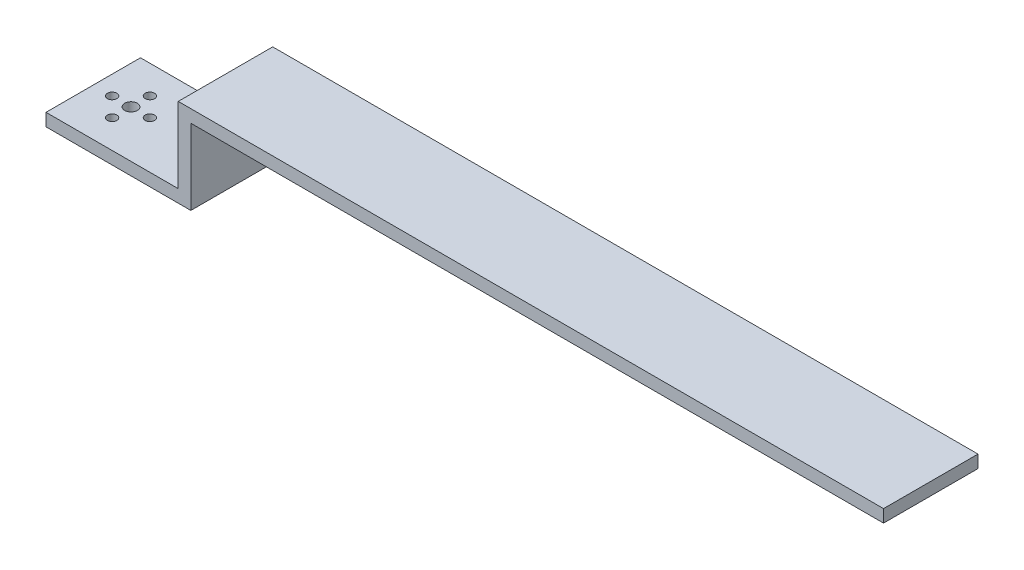
ISO-10303-21;
HEADER;
FILE_DESCRIPTION(('STEP AP214'),'2;1');
FILE_NAME('part.step','',(''),(''),'','','');
FILE_SCHEMA(('AUTOMOTIVE_DESIGN { 1 0 10303 214 1 1 1 1 }'));
ENDSEC;
DATA;
#1=APPLICATION_CONTEXT('core data for automotive mechanical design processes');
#2=APPLICATION_PROTOCOL_DEFINITION('international standard','automotive_design',2000,#1);
#3=PRODUCT_CONTEXT('',#1,'mechanical');
#4=PRODUCT('Part','Part','',(#3));
#5=PRODUCT_RELATED_PRODUCT_CATEGORY('part','',(#4));
#6=PRODUCT_DEFINITION_FORMATION('','',#4);
#7=PRODUCT_DEFINITION_CONTEXT('part definition',#1,'design');
#8=PRODUCT_DEFINITION('design','',#6,#7);
#9=PRODUCT_DEFINITION_SHAPE('','',#8);
#10=(LENGTH_UNIT() NAMED_UNIT(*) SI_UNIT(.MILLI.,.METRE.));
#11=(NAMED_UNIT(*) PLANE_ANGLE_UNIT() SI_UNIT($,.RADIAN.));
#12=(NAMED_UNIT(*) SI_UNIT($,.STERADIAN.) SOLID_ANGLE_UNIT());
#13=UNCERTAINTY_MEASURE_WITH_UNIT(LENGTH_MEASURE(1.E-05),#10,'distance_accuracy_value','');
#14=(GEOMETRIC_REPRESENTATION_CONTEXT(3) GLOBAL_UNCERTAINTY_ASSIGNED_CONTEXT((#13)) GLOBAL_UNIT_ASSIGNED_CONTEXT((#10,
#11,#12)) REPRESENTATION_CONTEXT('',''));
#15=CARTESIAN_POINT('',(0.,0.,0.));
#16=DIRECTION('',(0.,0.,1.));
#17=DIRECTION('',(1.,0.,0.));
#18=AXIS2_PLACEMENT_3D('',#15,#16,#17);
#19=CARTESIAN_POINT('',(23.,4.,-15.));
#20=DIRECTION('',(-1.,0.,0.));
#21=DIRECTION('',(0.,0.,1.));
#22=AXIS2_PLACEMENT_3D('',#19,#20,#21);
#23=PLANE('',#22);
#24=DIRECTION('',(0.,0.,-1.));
#25=VECTOR('',#24,1.);
#26=CARTESIAN_POINT('',(23.,24.,15.));
#27=LINE('',#26,#25);
#28=CARTESIAN_POINT('',(23.,24.,15.));
#29=VERTEX_POINT('',#28);
#30=CARTESIAN_POINT('',(23.,24.,-15.));
#31=VERTEX_POINT('',#30);
#32=EDGE_CURVE('E47',#29,#31,#27,.T.);
#33=ORIENTED_EDGE('',*,*,#32,.F.);
#34=DIRECTION('',(0.,-1.,0.));
#35=VECTOR('',#34,1.);
#36=CARTESIAN_POINT('',(23.,4.,15.));
#37=LINE('',#36,#35);
#38=CARTESIAN_POINT('',(23.,0.,15.));
#39=VERTEX_POINT('',#38);
#40=EDGE_CURVE('E119',#29,#39,#37,.T.);
#41=ORIENTED_EDGE('',*,*,#40,.T.);
#42=DIRECTION('',(0.,0.,-1.));
#43=VECTOR('',#42,1.);
#44=CARTESIAN_POINT('',(23.,0.,-15.));
#45=LINE('',#44,#43);
#46=CARTESIAN_POINT('',(23.,0.,-15.));
#47=VERTEX_POINT('',#46);
#48=EDGE_CURVE('E165',#39,#47,#45,.T.);
#49=ORIENTED_EDGE('',*,*,#48,.T.);
#50=DIRECTION('',(0.,-1.,0.));
#51=VECTOR('',#50,1.);
#52=CARTESIAN_POINT('',(23.,4.,-15.));
#53=LINE('',#52,#51);
#54=EDGE_CURVE('E11',#31,#47,#53,.T.);
#55=ORIENTED_EDGE('',*,*,#54,.F.);
#56=EDGE_LOOP('',(#33,#41,#49,#55));
#57=FACE_BOUND('',#56,.T.);
#58=ADVANCED_FACE('F33',(#57),#23,.F.);
#59=CARTESIAN_POINT('',(0.,4.,0.));
#60=DIRECTION('',(0.,1.,0.));
#61=DIRECTION('',(0.,0.,1.));
#62=AXIS2_PLACEMENT_3D('',#59,#60,#61);
#63=PLANE('',#62);
#64=DIRECTION('',(0.,0.,1.));
#65=VECTOR('',#64,1.);
#66=CARTESIAN_POINT('',(19.,4.,-15.));
#67=LINE('',#66,#65);
#68=CARTESIAN_POINT('',(19.,4.,-15.));
#69=VERTEX_POINT('',#68);
#70=CARTESIAN_POINT('',(19.,4.,15.));
#71=VERTEX_POINT('',#70);
#72=EDGE_CURVE('E55',#69,#71,#67,.T.);
#73=ORIENTED_EDGE('',*,*,#72,.F.);
#74=DIRECTION('',(-1.,0.,0.));
#75=VECTOR('',#74,1.);
#76=CARTESIAN_POINT('',(-23.,4.,-15.));
#77=LINE('',#76,#75);
#78=CARTESIAN_POINT('',(-23.,4.,-15.));
#79=VERTEX_POINT('',#78);
#80=EDGE_CURVE('E168',#69,#79,#77,.T.);
#81=ORIENTED_EDGE('',*,*,#80,.T.);
#82=DIRECTION('',(0.,0.,1.));
#83=VECTOR('',#82,1.);
#84=CARTESIAN_POINT('',(-23.,4.,-15.));
#85=LINE('',#84,#83);
#86=CARTESIAN_POINT('',(-23.,4.,15.));
#87=VERTEX_POINT('',#86);
#88=EDGE_CURVE('E170',#79,#87,#85,.T.);
#89=ORIENTED_EDGE('',*,*,#88,.T.);
#90=DIRECTION('',(1.,0.,0.));
#91=VECTOR('',#90,1.);
#92=CARTESIAN_POINT('',(-23.,4.,15.));
#93=LINE('',#92,#91);
#94=EDGE_CURVE('E173',#87,#71,#93,.T.);
#95=ORIENTED_EDGE('',*,*,#94,.T.);
#96=EDGE_LOOP('',(#73,#81,#89,#95));
#97=FACE_BOUND('',#96,.T.);
#98=CARTESIAN_POINT('',(-4.99999999999999,4.,0.));
#99=DIRECTION('',(0.,1.,0.));
#100=DIRECTION('',(0.,0.,1.));
#101=AXIS2_PLACEMENT_3D('',#98,#99,#100);
#102=CIRCLE('',#101,1.5);
#103=CARTESIAN_POINT('',(-4.99999999999999,4.,1.49999999999999));
#104=VERTEX_POINT('',#103);
#105=EDGE_CURVE('E144',#104,#104,#102,.T.);
#106=ORIENTED_EDGE('',*,*,#105,.F.);
#107=EDGE_LOOP('',(#106));
#108=FACE_BOUND('',#107,.T.);
#109=CARTESIAN_POINT('',(-11.,4.,0.));
#110=DIRECTION('',(0.,1.,0.));
#111=DIRECTION('',(0.,0.,1.));
#112=AXIS2_PLACEMENT_3D('',#109,#110,#111);
#113=CIRCLE('',#112,2.);
#114=CARTESIAN_POINT('',(-11.,4.,1.99999999999999));
#115=VERTEX_POINT('',#114);
#116=EDGE_CURVE('E156',#115,#115,#113,.T.);
#117=ORIENTED_EDGE('',*,*,#116,.F.);
#118=EDGE_LOOP('',(#117));
#119=FACE_BOUND('',#118,.T.);
#120=CARTESIAN_POINT('',(-17.,4.,0.));
#121=DIRECTION('',(0.,1.,0.));
#122=DIRECTION('',(0.,0.,1.));
#123=AXIS2_PLACEMENT_3D('',#120,#121,#122);
#124=CIRCLE('',#123,1.5);
#125=CARTESIAN_POINT('',(-17.,4.,1.49999999999999));
#126=VERTEX_POINT('',#125);
#127=EDGE_CURVE('E162',#126,#126,#124,.T.);
#128=ORIENTED_EDGE('',*,*,#127,.F.);
#129=EDGE_LOOP('',(#128));
#130=FACE_BOUND('',#129,.T.);
#131=CARTESIAN_POINT('',(-11.,4.,-6.00000000000001));
#132=DIRECTION('',(0.,1.,0.));
#133=DIRECTION('',(0.,0.,1.));
#134=AXIS2_PLACEMENT_3D('',#131,#132,#133);
#135=CIRCLE('',#134,1.5);
#136=CARTESIAN_POINT('',(-11.,4.,-4.50000000000001));
#137=VERTEX_POINT('',#136);
#138=EDGE_CURVE('E150',#137,#137,#135,.T.);
#139=ORIENTED_EDGE('',*,*,#138,.F.);
#140=EDGE_LOOP('',(#139));
#141=FACE_BOUND('',#140,.T.);
#142=CARTESIAN_POINT('',(-11.,4.,5.99999999999999));
#143=DIRECTION('',(0.,1.,0.));
#144=DIRECTION('',(0.,0.,1.));
#145=AXIS2_PLACEMENT_3D('',#142,#143,#144);
#146=CIRCLE('',#145,1.50000000000002);
#147=CARTESIAN_POINT('',(-11.,4.,7.50000000000001));
#148=VERTEX_POINT('',#147);
#149=EDGE_CURVE('E138',#148,#148,#146,.T.);
#150=ORIENTED_EDGE('',*,*,#149,.F.);
#151=EDGE_LOOP('',(#150));
#152=FACE_BOUND('',#151,.T.);
#153=ADVANCED_FACE('F201',(#97,#108,#119,#130,#141,#152),#63,.T.);
#154=CARTESIAN_POINT('',(0.,0.,0.));
#155=DIRECTION('',(0.,1.,0.));
#156=DIRECTION('',(0.,0.,1.));
#157=AXIS2_PLACEMENT_3D('',#154,#155,#156);
#158=PLANE('',#157);
#159=ORIENTED_EDGE('',*,*,#48,.F.);
#160=DIRECTION('',(1.,0.,0.));
#161=VECTOR('',#160,1.);
#162=CARTESIAN_POINT('',(-23.,0.,15.));
#163=LINE('',#162,#161);
#164=CARTESIAN_POINT('',(-23.,0.,15.));
#165=VERTEX_POINT('',#164);
#166=EDGE_CURVE('E171',#165,#39,#163,.T.);
#167=ORIENTED_EDGE('',*,*,#166,.F.);
#168=DIRECTION('',(0.,0.,1.));
#169=VECTOR('',#168,1.);
#170=CARTESIAN_POINT('',(-23.,0.,-15.));
#171=LINE('',#170,#169);
#172=CARTESIAN_POINT('',(-23.,0.,-15.));
#173=VERTEX_POINT('',#172);
#174=EDGE_CURVE('E179',#173,#165,#171,.T.);
#175=ORIENTED_EDGE('',*,*,#174,.F.);
#176=DIRECTION('',(-1.,0.,0.));
#177=VECTOR('',#176,1.);
#178=CARTESIAN_POINT('',(-23.,0.,-15.));
#179=LINE('',#178,#177);
#180=EDGE_CURVE('E177',#47,#173,#179,.T.);
#181=ORIENTED_EDGE('',*,*,#180,.F.);
#182=EDGE_LOOP('',(#159,#167,#175,#181));
#183=FACE_BOUND('',#182,.T.);
#184=CARTESIAN_POINT('',(-17.,0.,0.));
#185=DIRECTION('',(0.,1.,0.));
#186=DIRECTION('',(0.,0.,1.));
#187=AXIS2_PLACEMENT_3D('',#184,#185,#186);
#188=CIRCLE('',#187,1.5);
#189=CARTESIAN_POINT('',(-17.,0.,1.49999999999999));
#190=VERTEX_POINT('',#189);
#191=EDGE_CURVE('E159',#190,#190,#188,.T.);
#192=ORIENTED_EDGE('',*,*,#191,.T.);
#193=EDGE_LOOP('',(#192));
#194=FACE_BOUND('',#193,.T.);
#195=CARTESIAN_POINT('',(-11.,0.,0.));
#196=DIRECTION('',(0.,1.,0.));
#197=DIRECTION('',(0.,0.,1.));
#198=AXIS2_PLACEMENT_3D('',#195,#196,#197);
#199=CIRCLE('',#198,2.);
#200=CARTESIAN_POINT('',(-11.,0.,1.99999999999999));
#201=VERTEX_POINT('',#200);
#202=EDGE_CURVE('E153',#201,#201,#199,.T.);
#203=ORIENTED_EDGE('',*,*,#202,.T.);
#204=EDGE_LOOP('',(#203));
#205=FACE_BOUND('',#204,.T.);
#206=CARTESIAN_POINT('',(-11.,0.,-6.00000000000001));
#207=DIRECTION('',(0.,1.,0.));
#208=DIRECTION('',(0.,0.,1.));
#209=AXIS2_PLACEMENT_3D('',#206,#207,#208);
#210=CIRCLE('',#209,1.5);
#211=CARTESIAN_POINT('',(-11.,0.,-4.50000000000001));
#212=VERTEX_POINT('',#211);
#213=EDGE_CURVE('E147',#212,#212,#210,.T.);
#214=ORIENTED_EDGE('',*,*,#213,.T.);
#215=EDGE_LOOP('',(#214));
#216=FACE_BOUND('',#215,.T.);
#217=CARTESIAN_POINT('',(-4.99999999999999,0.,0.));
#218=DIRECTION('',(0.,1.,0.));
#219=DIRECTION('',(0.,0.,1.));
#220=AXIS2_PLACEMENT_3D('',#217,#218,#219);
#221=CIRCLE('',#220,1.5);
#222=CARTESIAN_POINT('',(-4.99999999999999,0.,1.49999999999999));
#223=VERTEX_POINT('',#222);
#224=EDGE_CURVE('E141',#223,#223,#221,.T.);
#225=ORIENTED_EDGE('',*,*,#224,.T.);
#226=EDGE_LOOP('',(#225));
#227=FACE_BOUND('',#226,.T.);
#228=CARTESIAN_POINT('',(-11.,0.,5.99999999999999));
#229=DIRECTION('',(0.,1.,0.));
#230=DIRECTION('',(0.,0.,1.));
#231=AXIS2_PLACEMENT_3D('',#228,#229,#230);
#232=CIRCLE('',#231,1.50000000000002);
#233=CARTESIAN_POINT('',(-11.,0.,7.50000000000001));
#234=VERTEX_POINT('',#233);
#235=EDGE_CURVE('E137',#234,#234,#232,.T.);
#236=ORIENTED_EDGE('',*,*,#235,.T.);
#237=EDGE_LOOP('',(#236));
#238=FACE_BOUND('',#237,.T.);
#239=ADVANCED_FACE('F197',(#183,#194,#205,#216,#227,#238),#158,.F.);
#240=CARTESIAN_POINT('',(-23.,4.,-15.));
#241=DIRECTION('',(0.,0.,1.));
#242=DIRECTION('',(1.,0.,0.));
#243=AXIS2_PLACEMENT_3D('',#240,#241,#242);
#244=PLANE('',#243);
#245=ORIENTED_EDGE('',*,*,#180,.T.);
#246=DIRECTION('',(0.,-1.,0.));
#247=VECTOR('',#246,1.);
#248=CARTESIAN_POINT('',(-23.,4.,-15.));
#249=LINE('',#248,#247);
#250=EDGE_CURVE('E40',#79,#173,#249,.T.);
#251=ORIENTED_EDGE('',*,*,#250,.F.);
#252=ORIENTED_EDGE('',*,*,#80,.F.);
#253=DIRECTION('',(0.,-1.,0.));
#254=VECTOR('',#253,1.);
#255=CARTESIAN_POINT('',(19.,28.,-15.));
#256=LINE('',#255,#254);
#257=CARTESIAN_POINT('',(19.,28.,-15.));
#258=VERTEX_POINT('',#257);
#259=EDGE_CURVE('E134',#258,#69,#256,.T.);
#260=ORIENTED_EDGE('',*,*,#259,.F.);
#261=DIRECTION('',(-1.,0.,0.));
#262=VECTOR('',#261,1.);
#263=CARTESIAN_POINT('',(23.,28.,-15.));
#264=LINE('',#263,#262);
#265=CARTESIAN_POINT('',(243.,28.,-15.0000000000001));
#266=VERTEX_POINT('',#265);
#267=EDGE_CURVE('E121',#266,#258,#264,.T.);
#268=ORIENTED_EDGE('',*,*,#267,.F.);
#269=DIRECTION('',(0.,1.,0.));
#270=VECTOR('',#269,1.);
#271=CARTESIAN_POINT('',(243.,28.,-15.0000000000001));
#272=LINE('',#271,#270);
#273=CARTESIAN_POINT('',(243.,24.,-15.0000000000001));
#274=VERTEX_POINT('',#273);
#275=EDGE_CURVE('E106',#274,#266,#272,.T.);
#276=ORIENTED_EDGE('',*,*,#275,.F.);
#277=DIRECTION('',(-1.,0.,0.));
#278=VECTOR('',#277,1.);
#279=CARTESIAN_POINT('',(243.,24.,-15.0000000000001));
#280=LINE('',#279,#278);
#281=EDGE_CURVE('E102',#274,#31,#280,.T.);
#282=ORIENTED_EDGE('',*,*,#281,.T.);
#283=ORIENTED_EDGE('',*,*,#54,.T.);
#284=EDGE_LOOP('',(#245,#251,#252,#260,#268,#276,#282,#283));
#285=FACE_BOUND('',#284,.T.);
#286=ADVANCED_FACE('F207',(#285),#244,.F.);
#287=CARTESIAN_POINT('',(-23.,4.,-15.));
#288=DIRECTION('',(1.,0.,0.));
#289=DIRECTION('',(0.,0.,-1.));
#290=AXIS2_PLACEMENT_3D('',#287,#288,#289);
#291=PLANE('',#290);
#292=ORIENTED_EDGE('',*,*,#174,.T.);
#293=DIRECTION('',(0.,-1.,0.));
#294=VECTOR('',#293,1.);
#295=CARTESIAN_POINT('',(-23.,4.,15.));
#296=LINE('',#295,#294);
#297=EDGE_CURVE('E183',#87,#165,#296,.T.);
#298=ORIENTED_EDGE('',*,*,#297,.F.);
#299=ORIENTED_EDGE('',*,*,#88,.F.);
#300=ORIENTED_EDGE('',*,*,#250,.T.);
#301=EDGE_LOOP('',(#292,#298,#299,#300));
#302=FACE_BOUND('',#301,.T.);
#303=ADVANCED_FACE('F190',(#302),#291,.F.);
#304=CARTESIAN_POINT('',(-23.,4.,15.));
#305=DIRECTION('',(0.,0.,-1.));
#306=DIRECTION('',(-1.,0.,0.));
#307=AXIS2_PLACEMENT_3D('',#304,#305,#306);
#308=PLANE('',#307);
#309=ORIENTED_EDGE('',*,*,#166,.T.);
#310=ORIENTED_EDGE('',*,*,#40,.F.);
#311=DIRECTION('',(-1.,0.,0.));
#312=VECTOR('',#311,1.);
#313=CARTESIAN_POINT('',(243.,24.,14.9999999999999));
#314=LINE('',#313,#312);
#315=CARTESIAN_POINT('',(243.,24.,14.9999999999999));
#316=VERTEX_POINT('',#315);
#317=EDGE_CURVE('E100',#316,#29,#314,.T.);
#318=ORIENTED_EDGE('',*,*,#317,.F.);
#319=DIRECTION('',(0.,-1.,0.));
#320=VECTOR('',#319,1.);
#321=CARTESIAN_POINT('',(243.,28.,14.9999999999999));
#322=LINE('',#321,#320);
#323=CARTESIAN_POINT('',(243.,28.,14.9999999999999));
#324=VERTEX_POINT('',#323);
#325=EDGE_CURVE('E107',#324,#316,#322,.T.);
#326=ORIENTED_EDGE('',*,*,#325,.F.);
#327=DIRECTION('',(1.,0.,0.));
#328=VECTOR('',#327,1.);
#329=CARTESIAN_POINT('',(23.,28.,15.));
#330=LINE('',#329,#328);
#331=CARTESIAN_POINT('',(19.,28.,15.));
#332=VERTEX_POINT('',#331);
#333=EDGE_CURVE('E129',#332,#324,#330,.T.);
#334=ORIENTED_EDGE('',*,*,#333,.F.);
#335=DIRECTION('',(0.,-1.,0.));
#336=VECTOR('',#335,1.);
#337=CARTESIAN_POINT('',(19.,28.,15.));
#338=LINE('',#337,#336);
#339=EDGE_CURVE('E130',#332,#71,#338,.T.);
#340=ORIENTED_EDGE('',*,*,#339,.T.);
#341=ORIENTED_EDGE('',*,*,#94,.F.);
#342=ORIENTED_EDGE('',*,*,#297,.T.);
#343=EDGE_LOOP('',(#309,#310,#318,#326,#334,#340,#341,#342));
#344=FACE_BOUND('',#343,.T.);
#345=ADVANCED_FACE('F118',(#344),#308,.F.);
#346=CARTESIAN_POINT('',(-17.,4.,0.));
#347=DIRECTION('',(0.,-1.,0.));
#348=DIRECTION('',(0.,0.,-1.));
#349=AXIS2_PLACEMENT_3D('',#346,#347,#348);
#350=CYLINDRICAL_SURFACE('',#349,1.5);
#351=ORIENTED_EDGE('',*,*,#127,.T.);
#352=EDGE_LOOP('',(#351));
#353=FACE_BOUND('',#352,.T.);
#354=ORIENTED_EDGE('',*,*,#191,.F.);
#355=EDGE_LOOP('',(#354));
#356=FACE_BOUND('',#355,.T.);
#357=ADVANCED_FACE('F222',(#353,#356),#350,.F.);
#358=CARTESIAN_POINT('',(-11.,4.,0.));
#359=DIRECTION('',(0.,-1.,0.));
#360=DIRECTION('',(0.,0.,-1.));
#361=AXIS2_PLACEMENT_3D('',#358,#359,#360);
#362=CYLINDRICAL_SURFACE('',#361,2.);
#363=ORIENTED_EDGE('',*,*,#116,.T.);
#364=EDGE_LOOP('',(#363));
#365=FACE_BOUND('',#364,.T.);
#366=ORIENTED_EDGE('',*,*,#202,.F.);
#367=EDGE_LOOP('',(#366));
#368=FACE_BOUND('',#367,.T.);
#369=ADVANCED_FACE('F248',(#365,#368),#362,.F.);
#370=CARTESIAN_POINT('',(-11.,4.,-6.00000000000001));
#371=DIRECTION('',(0.,-1.,0.));
#372=DIRECTION('',(0.,0.,-1.));
#373=AXIS2_PLACEMENT_3D('',#370,#371,#372);
#374=CYLINDRICAL_SURFACE('',#373,1.5);
#375=ORIENTED_EDGE('',*,*,#138,.T.);
#376=EDGE_LOOP('',(#375));
#377=FACE_BOUND('',#376,.T.);
#378=ORIENTED_EDGE('',*,*,#213,.F.);
#379=EDGE_LOOP('',(#378));
#380=FACE_BOUND('',#379,.T.);
#381=ADVANCED_FACE('F255',(#377,#380),#374,.F.);
#382=CARTESIAN_POINT('',(-4.99999999999999,4.,0.));
#383=DIRECTION('',(0.,-1.,0.));
#384=DIRECTION('',(0.,0.,-1.));
#385=AXIS2_PLACEMENT_3D('',#382,#383,#384);
#386=CYLINDRICAL_SURFACE('',#385,1.5);
#387=ORIENTED_EDGE('',*,*,#105,.T.);
#388=EDGE_LOOP('',(#387));
#389=FACE_BOUND('',#388,.T.);
#390=ORIENTED_EDGE('',*,*,#224,.F.);
#391=EDGE_LOOP('',(#390));
#392=FACE_BOUND('',#391,.T.);
#393=ADVANCED_FACE('F262',(#389,#392),#386,.F.);
#394=CARTESIAN_POINT('',(-11.,4.,5.99999999999999));
#395=DIRECTION('',(0.,-1.,0.));
#396=DIRECTION('',(0.,0.,-1.));
#397=AXIS2_PLACEMENT_3D('',#394,#395,#396);
#398=CYLINDRICAL_SURFACE('',#397,1.50000000000002);
#399=ORIENTED_EDGE('',*,*,#149,.T.);
#400=EDGE_LOOP('',(#399));
#401=FACE_BOUND('',#400,.T.);
#402=ORIENTED_EDGE('',*,*,#235,.F.);
#403=EDGE_LOOP('',(#402));
#404=FACE_BOUND('',#403,.T.);
#405=ADVANCED_FACE('F270',(#401,#404),#398,.F.);
#406=CARTESIAN_POINT('',(19.,28.,-15.));
#407=DIRECTION('',(1.,0.,0.));
#408=DIRECTION('',(0.,0.,-1.));
#409=AXIS2_PLACEMENT_3D('',#406,#407,#408);
#410=PLANE('',#409);
#411=ORIENTED_EDGE('',*,*,#72,.T.);
#412=ORIENTED_EDGE('',*,*,#339,.F.);
#413=DIRECTION('',(0.,0.,1.));
#414=VECTOR('',#413,1.);
#415=CARTESIAN_POINT('',(19.,28.,-15.));
#416=LINE('',#415,#414);
#417=EDGE_CURVE('E127',#258,#332,#416,.T.);
#418=ORIENTED_EDGE('',*,*,#417,.F.);
#419=ORIENTED_EDGE('',*,*,#259,.T.);
#420=EDGE_LOOP('',(#411,#412,#418,#419));
#421=FACE_BOUND('',#420,.T.);
#422=ADVANCED_FACE('F204',(#421),#410,.F.);
#423=CARTESIAN_POINT('',(0.,28.,0.));
#424=DIRECTION('',(0.,-1.,0.));
#425=DIRECTION('',(0.,0.,-1.));
#426=AXIS2_PLACEMENT_3D('',#423,#424,#425);
#427=PLANE('',#426);
#428=ORIENTED_EDGE('',*,*,#333,.T.);
#429=DIRECTION('',(0.,0.,1.));
#430=VECTOR('',#429,1.);
#431=CARTESIAN_POINT('',(243.,28.,14.9999999999999));
#432=LINE('',#431,#430);
#433=EDGE_CURVE('E113',#266,#324,#432,.T.);
#434=ORIENTED_EDGE('',*,*,#433,.F.);
#435=ORIENTED_EDGE('',*,*,#267,.T.);
#436=ORIENTED_EDGE('',*,*,#417,.T.);
#437=EDGE_LOOP('',(#428,#434,#435,#436));
#438=FACE_BOUND('',#437,.T.);
#439=ADVANCED_FACE('F210',(#438),#427,.F.);
#440=CARTESIAN_POINT('',(243.,24.,14.9999999999999));
#441=DIRECTION('',(0.,1.,0.));
#442=DIRECTION('',(0.,0.,1.));
#443=AXIS2_PLACEMENT_3D('',#440,#441,#442);
#444=PLANE('',#443);
#445=ORIENTED_EDGE('',*,*,#32,.T.);
#446=ORIENTED_EDGE('',*,*,#281,.F.);
#447=DIRECTION('',(0.,0.,-1.));
#448=VECTOR('',#447,1.);
#449=CARTESIAN_POINT('',(243.,24.,14.9999999999999));
#450=LINE('',#449,#448);
#451=EDGE_CURVE('E96',#316,#274,#450,.T.);
#452=ORIENTED_EDGE('',*,*,#451,.F.);
#453=ORIENTED_EDGE('',*,*,#317,.T.);
#454=EDGE_LOOP('',(#445,#446,#452,#453));
#455=FACE_BOUND('',#454,.T.);
#456=ADVANCED_FACE('F98',(#455),#444,.F.);
#457=CARTESIAN_POINT('',(243.,0.,-1.12410081243297E-13));
#458=DIRECTION('',(1.,0.,0.));
#459=DIRECTION('',(0.,0.,-1.));
#460=AXIS2_PLACEMENT_3D('',#457,#458,#459);
#461=PLANE('',#460);
#462=ORIENTED_EDGE('',*,*,#325,.T.);
#463=ORIENTED_EDGE('',*,*,#451,.T.);
#464=ORIENTED_EDGE('',*,*,#275,.T.);
#465=ORIENTED_EDGE('',*,*,#433,.T.);
#466=EDGE_LOOP('',(#462,#463,#464,#465));
#467=FACE_BOUND('',#466,.T.);
#468=ADVANCED_FACE('F111',(#467),#461,.T.);
#469=CLOSED_SHELL('',(#58,#153,#239,#286,#303,#345,#357,#369,#381,#393,#405,#422,#439,#456,#468));
#470=MANIFOLD_SOLID_BREP('B2',#469);
#471=ADVANCED_BREP_SHAPE_REPRESENTATION('',(#18,#470),#14);
#472=SHAPE_DEFINITION_REPRESENTATION(#9,#471);
ENDSEC;
END-ISO-10303-21;
